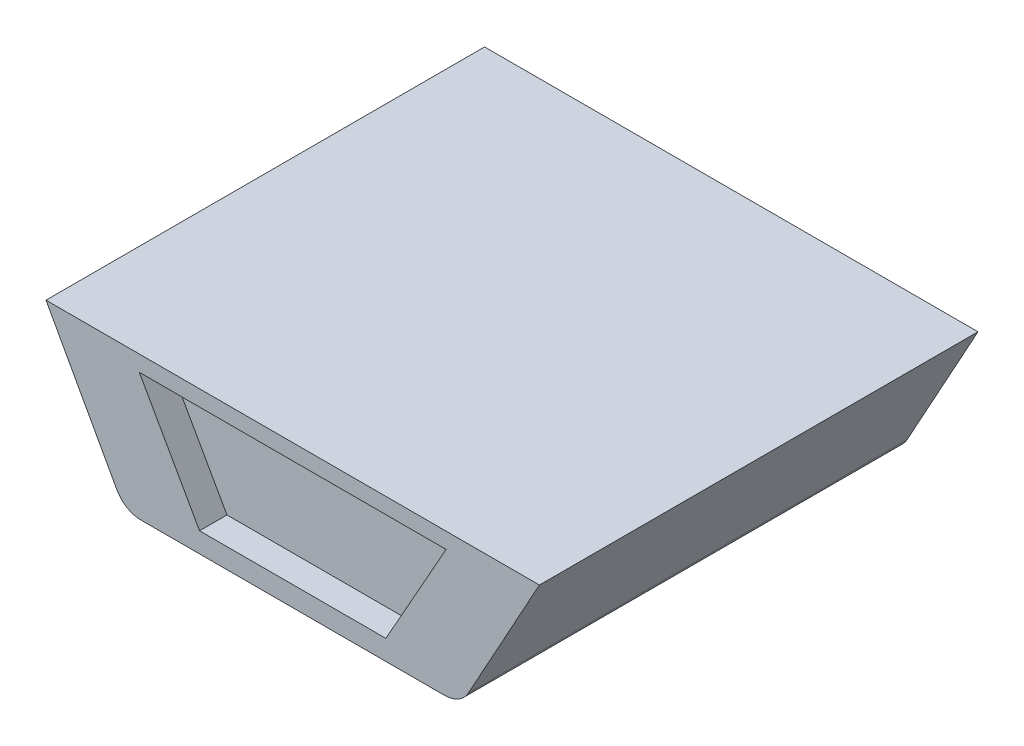
ISO-10303-21;
HEADER;
FILE_DESCRIPTION(('STEP AP214'),'2;1');
FILE_NAME('part.step','',(''),(''),'','','');
FILE_SCHEMA(('AUTOMOTIVE_DESIGN { 1 0 10303 214 1 1 1 1 }'));
ENDSEC;
DATA;
#1=APPLICATION_CONTEXT('core data for automotive mechanical design processes');
#2=APPLICATION_PROTOCOL_DEFINITION('international standard','automotive_design',2000,#1);
#3=PRODUCT_CONTEXT('',#1,'mechanical');
#4=PRODUCT('Part','Part','',(#3));
#5=PRODUCT_RELATED_PRODUCT_CATEGORY('part','',(#4));
#6=PRODUCT_DEFINITION_FORMATION('','',#4);
#7=PRODUCT_DEFINITION_CONTEXT('part definition',#1,'design');
#8=PRODUCT_DEFINITION('design','',#6,#7);
#9=PRODUCT_DEFINITION_SHAPE('','',#8);
#10=(LENGTH_UNIT() NAMED_UNIT(*) SI_UNIT(.MILLI.,.METRE.));
#11=(NAMED_UNIT(*) PLANE_ANGLE_UNIT() SI_UNIT($,.RADIAN.));
#12=(NAMED_UNIT(*) SI_UNIT($,.STERADIAN.) SOLID_ANGLE_UNIT());
#13=UNCERTAINTY_MEASURE_WITH_UNIT(LENGTH_MEASURE(1.E-05),#10,'distance_accuracy_value','');
#14=(GEOMETRIC_REPRESENTATION_CONTEXT(3) GLOBAL_UNCERTAINTY_ASSIGNED_CONTEXT((#13)) GLOBAL_UNIT_ASSIGNED_CONTEXT((#10,
#11,#12)) REPRESENTATION_CONTEXT('',''));
#15=CARTESIAN_POINT('',(0.,0.,0.));
#16=DIRECTION('',(0.,0.,1.));
#17=DIRECTION('',(1.,0.,0.));
#18=AXIS2_PLACEMENT_3D('',#15,#16,#17);
#19=CARTESIAN_POINT('',(-70.0985456524814,-38.5749393235548,203.2));
#20=DIRECTION('',(0.87610643371878,0.482117741632228,0.));
#21=DIRECTION('',(-0.482117741632228,0.876106433718781,0.));
#22=AXIS2_PLACEMENT_3D('',#19,#20,#21);
#23=PLANE('',#22);
#24=DIRECTION('',(0.482117741632228,-0.876106433718781,0.));
#25=VECTOR('',#24,1.);
#26=CARTESIAN_POINT('',(-70.0985456524814,-38.5749393235548,0.));
#27=LINE('',#26,#25);
#28=CARTESIAN_POINT('',(-114.3,41.7481336305382,0.));
#29=VERTEX_POINT('',#28);
#30=CARTESIAN_POINT('',(-81.463236772202,-17.9229737404066,0.));
#31=VERTEX_POINT('',#30);
#32=EDGE_CURVE('E208',#29,#31,#27,.T.);
#33=ORIENTED_EDGE('',*,*,#32,.T.);
#34=DIRECTION('',(0.,0.,-1.));
#35=VECTOR('',#34,1.);
#36=CARTESIAN_POINT('',(-81.463236772202,-17.9229737404066,203.2));
#37=LINE('',#36,#35);
#38=CARTESIAN_POINT('',(-81.463236772202,-17.9229737404066,203.2));
#39=VERTEX_POINT('',#38);
#40=EDGE_CURVE('E58',#31,#39,#37,.F.);
#41=ORIENTED_EDGE('',*,*,#40,.T.);
#42=DIRECTION('',(0.482117741632228,-0.876106433718781,0.));
#43=VECTOR('',#42,1.);
#44=CARTESIAN_POINT('',(-70.0985456524814,-38.5749393235548,203.2));
#45=LINE('',#44,#43);
#46=CARTESIAN_POINT('',(-114.3,41.7481336305382,203.2));
#47=VERTEX_POINT('',#46);
#48=EDGE_CURVE('E215',#47,#39,#45,.T.);
#49=ORIENTED_EDGE('',*,*,#48,.F.);
#50=DIRECTION('',(0.,0.,-1.));
#51=VECTOR('',#50,1.);
#52=CARTESIAN_POINT('',(-114.3,41.7481336305382,203.2));
#53=LINE('',#52,#51);
#54=EDGE_CURVE('E226',#47,#29,#53,.T.);
#55=ORIENTED_EDGE('',*,*,#54,.T.);
#56=EDGE_LOOP('',(#33,#41,#49,#55));
#57=FACE_BOUND('',#56,.T.);
#58=ADVANCED_FACE('F35',(#57),#23,.F.);
#59=CARTESIAN_POINT('',(0.,-24.5000784216773,203.2));
#60=DIRECTION('',(0.,-1.,0.));
#61=DIRECTION('',(1.,0.,0.));
#62=AXIS2_PLACEMENT_3D('',#59,#60,#61);
#63=PLANE('',#62);
#64=DIRECTION('',(-1.,0.,0.));
#65=VECTOR('',#64,1.);
#66=CARTESIAN_POINT('',(0.,-24.5000784216773,203.2));
#67=LINE('',#66,#65);
#68=CARTESIAN_POINT('',(70.3366850639734,-24.5000784216773,203.2));
#69=VERTEX_POINT('',#68);
#70=CARTESIAN_POINT('',(-70.3366850639735,-24.5000784216773,203.2));
#71=VERTEX_POINT('',#70);
#72=EDGE_CURVE('E217',#69,#71,#67,.T.);
#73=ORIENTED_EDGE('',*,*,#72,.T.);
#74=DIRECTION('',(0.,0.,-1.));
#75=VECTOR('',#74,1.);
#76=CARTESIAN_POINT('',(-70.3366850639735,-24.5000784216773,0.));
#77=LINE('',#76,#75);
#78=CARTESIAN_POINT('',(-70.3366850639735,-24.5000784216773,0.));
#79=VERTEX_POINT('',#78);
#80=EDGE_CURVE('E241',#71,#79,#77,.T.);
#81=ORIENTED_EDGE('',*,*,#80,.T.);
#82=DIRECTION('',(-1.,0.,0.));
#83=VECTOR('',#82,1.);
#84=CARTESIAN_POINT('',(0.,-24.5000784216773,0.));
#85=LINE('',#84,#83);
#86=CARTESIAN_POINT('',(70.3366850639734,-24.5000784216773,0.));
#87=VERTEX_POINT('',#86);
#88=EDGE_CURVE('E228',#87,#79,#85,.T.);
#89=ORIENTED_EDGE('',*,*,#88,.F.);
#90=DIRECTION('',(0.,0.,-1.));
#91=VECTOR('',#90,1.);
#92=CARTESIAN_POINT('',(70.3366850639734,-24.5000784216773,203.2));
#93=LINE('',#92,#91);
#94=EDGE_CURVE('E239',#87,#69,#93,.F.);
#95=ORIENTED_EDGE('',*,*,#94,.T.);
#96=EDGE_LOOP('',(#73,#81,#89,#95));
#97=FACE_BOUND('',#96,.T.);
#98=ADVANCED_FACE('F255',(#97),#63,.T.);
#99=CARTESIAN_POINT('',(70.0985456524814,-38.5749393235548,203.2));
#100=DIRECTION('',(0.87610643371878,-0.482117741632228,0.));
#101=DIRECTION('',(0.482117741632228,0.876106433718781,0.));
#102=AXIS2_PLACEMENT_3D('',#99,#100,#101);
#103=PLANE('',#102);
#104=DIRECTION('',(-0.482117741632228,-0.876106433718781,0.));
#105=VECTOR('',#104,1.);
#106=CARTESIAN_POINT('',(70.0985456524814,-38.5749393235548,203.2));
#107=LINE('',#106,#105);
#108=CARTESIAN_POINT('',(114.3,41.7481336305382,203.2));
#109=VERTEX_POINT('',#108);
#110=CARTESIAN_POINT('',(81.463236772202,-17.9229737404066,203.2));
#111=VERTEX_POINT('',#110);
#112=EDGE_CURVE('E221',#109,#111,#107,.T.);
#113=ORIENTED_EDGE('',*,*,#112,.T.);
#114=DIRECTION('',(0.,0.,-1.));
#115=VECTOR('',#114,1.);
#116=CARTESIAN_POINT('',(81.463236772202,-17.9229737404066,203.2));
#117=LINE('',#116,#115);
#118=CARTESIAN_POINT('',(81.463236772202,-17.9229737404066,0.));
#119=VERTEX_POINT('',#118);
#120=EDGE_CURVE('E11',#111,#119,#117,.T.);
#121=ORIENTED_EDGE('',*,*,#120,.T.);
#122=DIRECTION('',(-0.482117741632228,-0.876106433718781,0.));
#123=VECTOR('',#122,1.);
#124=CARTESIAN_POINT('',(70.0985456524814,-38.5749393235548,0.));
#125=LINE('',#124,#123);
#126=CARTESIAN_POINT('',(114.3,41.7481336305382,0.));
#127=VERTEX_POINT('',#126);
#128=EDGE_CURVE('E231',#127,#119,#125,.T.);
#129=ORIENTED_EDGE('',*,*,#128,.F.);
#130=DIRECTION('',(0.,0.,-1.));
#131=VECTOR('',#130,1.);
#132=CARTESIAN_POINT('',(114.3,41.7481336305382,203.2));
#133=LINE('',#132,#131);
#134=EDGE_CURVE('E237',#109,#127,#133,.T.);
#135=ORIENTED_EDGE('',*,*,#134,.F.);
#136=EDGE_LOOP('',(#113,#121,#129,#135));
#137=FACE_BOUND('',#136,.T.);
#138=ADVANCED_FACE('F267',(#137),#103,.T.);
#139=CARTESIAN_POINT('',(0.,41.7481336305382,203.2));
#140=DIRECTION('',(0.,1.,0.));
#141=DIRECTION('',(-1.,0.,0.));
#142=AXIS2_PLACEMENT_3D('',#139,#140,#141);
#143=PLANE('',#142);
#144=DIRECTION('',(1.,0.,0.));
#145=VECTOR('',#144,1.);
#146=CARTESIAN_POINT('',(0.,41.7481336305382,0.));
#147=LINE('',#146,#145);
#148=EDGE_CURVE('E218',#29,#127,#147,.T.);
#149=ORIENTED_EDGE('',*,*,#148,.F.);
#150=ORIENTED_EDGE('',*,*,#54,.F.);
#151=DIRECTION('',(1.,0.,0.));
#152=VECTOR('',#151,1.);
#153=CARTESIAN_POINT('',(0.,41.7481336305382,203.2));
#154=LINE('',#153,#152);
#155=EDGE_CURVE('E223',#47,#109,#154,.T.);
#156=ORIENTED_EDGE('',*,*,#155,.T.);
#157=ORIENTED_EDGE('',*,*,#134,.T.);
#158=EDGE_LOOP('',(#149,#150,#156,#157));
#159=FACE_BOUND('',#158,.T.);
#160=ADVANCED_FACE('F264',(#159),#143,.T.);
#161=CARTESIAN_POINT('',(0.,0.,203.2));
#162=DIRECTION('',(0.,0.,1.));
#163=DIRECTION('',(1.,0.,0.));
#164=AXIS2_PLACEMENT_3D('',#161,#162,#163);
#165=PLANE('',#164);
#166=DIRECTION('',(0.490144981755459,-0.871640921974147,0.));
#167=VECTOR('',#166,1.);
#168=CARTESIAN_POINT('',(-71.0759168581774,34.4133253858701,203.2));
#169=LINE('',#168,#167);
#170=CARTESIAN_POINT('',(-71.0759168581774,34.4133253858701,203.2));
#171=VERTEX_POINT('',#170);
#172=CARTESIAN_POINT('',(-43.1627081710388,-15.2256505517698,203.2));
#173=VERTEX_POINT('',#172);
#174=EDGE_CURVE('E147',#171,#173,#169,.T.);
#175=ORIENTED_EDGE('',*,*,#174,.F.);
#176=DIRECTION('',(-1.,0.,0.));
#177=VECTOR('',#176,1.);
#178=CARTESIAN_POINT('',(71.0759168581774,34.4133253858701,203.2));
#179=LINE('',#178,#177);
#180=CARTESIAN_POINT('',(71.0759168581774,34.4133253858701,203.2));
#181=VERTEX_POINT('',#180);
#182=EDGE_CURVE('E164',#181,#171,#179,.T.);
#183=ORIENTED_EDGE('',*,*,#182,.F.);
#184=DIRECTION('',(0.490144981755459,0.871640921974147,0.));
#185=VECTOR('',#184,1.);
#186=CARTESIAN_POINT('',(71.0759168581774,34.4133253858701,203.2));
#187=LINE('',#186,#185);
#188=CARTESIAN_POINT('',(43.1627081710388,-15.2256505517698,203.2));
#189=VERTEX_POINT('',#188);
#190=EDGE_CURVE('E167',#189,#181,#187,.T.);
#191=ORIENTED_EDGE('',*,*,#190,.F.);
#192=DIRECTION('',(1.,0.,0.));
#193=VECTOR('',#192,1.);
#194=CARTESIAN_POINT('',(-43.1627081710388,-15.2256505517698,203.2));
#195=LINE('',#194,#193);
#196=EDGE_CURVE('E173',#173,#189,#195,.T.);
#197=ORIENTED_EDGE('',*,*,#196,.F.);
#198=EDGE_LOOP('',(#175,#183,#191,#197));
#199=FACE_BOUND('',#198,.T.);
#200=ORIENTED_EDGE('',*,*,#48,.T.);
#201=CARTESIAN_POINT('',(-70.3366850639735,-11.8000784216773,203.2));
#202=DIRECTION('',(0.,0.,1.));
#203=DIRECTION('',(1.,0.,0.));
#204=AXIS2_PLACEMENT_3D('',#201,#202,#203);
#205=CIRCLE('',#204,12.7);
#206=EDGE_CURVE('E43',#39,#71,#205,.T.);
#207=ORIENTED_EDGE('',*,*,#206,.T.);
#208=ORIENTED_EDGE('',*,*,#72,.F.);
#209=CARTESIAN_POINT('',(70.3366850639734,-11.8000784216773,203.2));
#210=DIRECTION('',(0.,0.,1.));
#211=DIRECTION('',(1.,0.,0.));
#212=AXIS2_PLACEMENT_3D('',#209,#210,#211);
#213=CIRCLE('',#212,12.7);
#214=EDGE_CURVE('E50',#69,#111,#213,.T.);
#215=ORIENTED_EDGE('',*,*,#214,.T.);
#216=ORIENTED_EDGE('',*,*,#112,.F.);
#217=ORIENTED_EDGE('',*,*,#155,.F.);
#218=EDGE_LOOP('',(#200,#207,#208,#215,#216,#217));
#219=FACE_BOUND('',#218,.T.);
#220=ADVANCED_FACE('F250',(#199,#219),#165,.T.);
#221=CARTESIAN_POINT('',(0.,0.,0.));
#222=DIRECTION('',(0.,0.,1.));
#223=DIRECTION('',(1.,0.,0.));
#224=AXIS2_PLACEMENT_3D('',#221,#222,#223);
#225=PLANE('',#224);
#226=DIRECTION('',(-1.,0.,0.));
#227=VECTOR('',#226,1.);
#228=CARTESIAN_POINT('',(40.3989196293821,-12.2945288675993,0.));
#229=LINE('',#228,#227);
#230=CARTESIAN_POINT('',(40.3989196293821,-12.2945288675993,0.));
#231=VERTEX_POINT('',#230);
#232=CARTESIAN_POINT('',(-40.3989196293821,-12.2945288675993,0.));
#233=VERTEX_POINT('',#232);
#234=EDGE_CURVE('E198',#231,#233,#229,.T.);
#235=ORIENTED_EDGE('',*,*,#234,.F.);
#236=DIRECTION('',(-0.41926540400879,-0.907863712790277,0.));
#237=VECTOR('',#236,1.);
#238=CARTESIAN_POINT('',(61.6109656640447,33.6373478977521,0.));
#239=LINE('',#238,#237);
#240=CARTESIAN_POINT('',(61.6109656640447,33.6373478977521,0.));
#241=VERTEX_POINT('',#240);
#242=EDGE_CURVE('E179',#241,#231,#239,.T.);
#243=ORIENTED_EDGE('',*,*,#242,.F.);
#244=DIRECTION('',(1.,0.,0.));
#245=VECTOR('',#244,1.);
#246=CARTESIAN_POINT('',(-61.6109656640447,33.6373478977521,0.));
#247=LINE('',#246,#245);
#248=CARTESIAN_POINT('',(-61.6109656640447,33.6373478977521,0.));
#249=VERTEX_POINT('',#248);
#250=EDGE_CURVE('E187',#249,#241,#247,.T.);
#251=ORIENTED_EDGE('',*,*,#250,.F.);
#252=DIRECTION('',(-0.41926540400879,0.907863712790277,0.));
#253=VECTOR('',#252,1.);
#254=CARTESIAN_POINT('',(-61.6109656640447,33.6373478977521,0.));
#255=LINE('',#254,#253);
#256=EDGE_CURVE('E201',#233,#249,#255,.T.);
#257=ORIENTED_EDGE('',*,*,#256,.F.);
#258=EDGE_LOOP('',(#235,#243,#251,#257));
#259=FACE_BOUND('',#258,.T.);
#260=ORIENTED_EDGE('',*,*,#88,.T.);
#261=CARTESIAN_POINT('',(-70.3366850639735,-11.8000784216773,0.));
#262=DIRECTION('',(0.,0.,1.));
#263=DIRECTION('',(1.,0.,0.));
#264=AXIS2_PLACEMENT_3D('',#261,#262,#263);
#265=CIRCLE('',#264,12.7);
#266=EDGE_CURVE('E246',#79,#31,#265,.F.);
#267=ORIENTED_EDGE('',*,*,#266,.T.);
#268=ORIENTED_EDGE('',*,*,#32,.F.);
#269=ORIENTED_EDGE('',*,*,#148,.T.);
#270=ORIENTED_EDGE('',*,*,#128,.T.);
#271=CARTESIAN_POINT('',(70.3366850639734,-11.8000784216773,0.));
#272=DIRECTION('',(0.,0.,1.));
#273=DIRECTION('',(1.,0.,0.));
#274=AXIS2_PLACEMENT_3D('',#271,#272,#273);
#275=CIRCLE('',#274,12.7);
#276=EDGE_CURVE('E244',#119,#87,#275,.F.);
#277=ORIENTED_EDGE('',*,*,#276,.T.);
#278=EDGE_LOOP('',(#260,#267,#268,#269,#270,#277));
#279=FACE_BOUND('',#278,.T.);
#280=ADVANCED_FACE('F261',(#259,#279),#225,.F.);
#281=CARTESIAN_POINT('',(61.6109656640447,33.6373478977521,12.7));
#282=DIRECTION('',(0.907863712790277,-0.41926540400879,0.));
#283=DIRECTION('',(0.41926540400879,0.907863712790277,0.));
#284=AXIS2_PLACEMENT_3D('',#281,#282,#283);
#285=PLANE('',#284);
#286=ORIENTED_EDGE('',*,*,#242,.T.);
#287=DIRECTION('',(0.,0.,-1.));
#288=VECTOR('',#287,1.);
#289=CARTESIAN_POINT('',(40.3989196293821,-12.2945288675993,12.7));
#290=LINE('',#289,#288);
#291=CARTESIAN_POINT('',(40.3989196293821,-12.2945288675993,12.7));
#292=VERTEX_POINT('',#291);
#293=EDGE_CURVE('E196',#292,#231,#290,.T.);
#294=ORIENTED_EDGE('',*,*,#293,.F.);
#295=DIRECTION('',(-0.41926540400879,-0.907863712790277,0.));
#296=VECTOR('',#295,1.);
#297=CARTESIAN_POINT('',(61.6109656640447,33.6373478977521,12.7));
#298=LINE('',#297,#296);
#299=CARTESIAN_POINT('',(61.6109656640447,33.6373478977521,12.7));
#300=VERTEX_POINT('',#299);
#301=EDGE_CURVE('E183',#300,#292,#298,.T.);
#302=ORIENTED_EDGE('',*,*,#301,.F.);
#303=DIRECTION('',(0.,0.,-1.));
#304=VECTOR('',#303,1.);
#305=CARTESIAN_POINT('',(61.6109656640447,33.6373478977521,12.7));
#306=LINE('',#305,#304);
#307=EDGE_CURVE('E206',#300,#241,#306,.T.);
#308=ORIENTED_EDGE('',*,*,#307,.T.);
#309=EDGE_LOOP('',(#286,#294,#302,#308));
#310=FACE_BOUND('',#309,.T.);
#311=ADVANCED_FACE('F287',(#310),#285,.F.);
#312=CARTESIAN_POINT('',(-61.6109656640447,33.6373478977521,12.7));
#313=DIRECTION('',(0.,1.,0.));
#314=DIRECTION('',(0.,0.,1.));
#315=AXIS2_PLACEMENT_3D('',#312,#313,#314);
#316=PLANE('',#315);
#317=ORIENTED_EDGE('',*,*,#250,.T.);
#318=ORIENTED_EDGE('',*,*,#307,.F.);
#319=DIRECTION('',(1.,0.,0.));
#320=VECTOR('',#319,1.);
#321=CARTESIAN_POINT('',(-61.6109656640447,33.6373478977521,12.7));
#322=LINE('',#321,#320);
#323=CARTESIAN_POINT('',(-61.6109656640447,33.6373478977521,12.7));
#324=VERTEX_POINT('',#323);
#325=EDGE_CURVE('E193',#324,#300,#322,.T.);
#326=ORIENTED_EDGE('',*,*,#325,.F.);
#327=DIRECTION('',(0.,0.,-1.));
#328=VECTOR('',#327,1.);
#329=CARTESIAN_POINT('',(-61.6109656640447,33.6373478977521,12.7));
#330=LINE('',#329,#328);
#331=EDGE_CURVE('E209',#324,#249,#330,.T.);
#332=ORIENTED_EDGE('',*,*,#331,.T.);
#333=EDGE_LOOP('',(#317,#318,#326,#332));
#334=FACE_BOUND('',#333,.T.);
#335=ADVANCED_FACE('F294',(#334),#316,.F.);
#336=CARTESIAN_POINT('',(-61.6109656640447,33.6373478977521,12.7));
#337=DIRECTION('',(-0.907863712790277,-0.41926540400879,0.));
#338=DIRECTION('',(0.41926540400879,-0.907863712790277,0.));
#339=AXIS2_PLACEMENT_3D('',#336,#337,#338);
#340=PLANE('',#339);
#341=ORIENTED_EDGE('',*,*,#256,.T.);
#342=ORIENTED_EDGE('',*,*,#331,.F.);
#343=DIRECTION('',(-0.41926540400879,0.907863712790277,0.));
#344=VECTOR('',#343,1.);
#345=CARTESIAN_POINT('',(-61.6109656640447,33.6373478977521,12.7));
#346=LINE('',#345,#344);
#347=CARTESIAN_POINT('',(-40.3989196293821,-12.2945288675993,12.7));
#348=VERTEX_POINT('',#347);
#349=EDGE_CURVE('E190',#348,#324,#346,.T.);
#350=ORIENTED_EDGE('',*,*,#349,.F.);
#351=DIRECTION('',(0.,0.,-1.));
#352=VECTOR('',#351,1.);
#353=CARTESIAN_POINT('',(-40.3989196293821,-12.2945288675993,12.7));
#354=LINE('',#353,#352);
#355=EDGE_CURVE('E211',#348,#233,#354,.T.);
#356=ORIENTED_EDGE('',*,*,#355,.T.);
#357=EDGE_LOOP('',(#341,#342,#350,#356));
#358=FACE_BOUND('',#357,.T.);
#359=ADVANCED_FACE('F300',(#358),#340,.F.);
#360=CARTESIAN_POINT('',(40.3989196293821,-12.2945288675993,12.7));
#361=DIRECTION('',(0.,-1.,0.));
#362=DIRECTION('',(0.,0.,-1.));
#363=AXIS2_PLACEMENT_3D('',#360,#361,#362);
#364=PLANE('',#363);
#365=ORIENTED_EDGE('',*,*,#234,.T.);
#366=ORIENTED_EDGE('',*,*,#355,.F.);
#367=DIRECTION('',(-1.,0.,0.));
#368=VECTOR('',#367,1.);
#369=CARTESIAN_POINT('',(40.3989196293821,-12.2945288675993,12.7));
#370=LINE('',#369,#368);
#371=EDGE_CURVE('E186',#292,#348,#370,.T.);
#372=ORIENTED_EDGE('',*,*,#371,.F.);
#373=ORIENTED_EDGE('',*,*,#293,.T.);
#374=EDGE_LOOP('',(#365,#366,#372,#373));
#375=FACE_BOUND('',#374,.T.);
#376=ADVANCED_FACE('F296',(#375),#364,.F.);
#377=CARTESIAN_POINT('',(0.,0.,12.7));
#378=DIRECTION('',(0.,0.,-1.));
#379=DIRECTION('',(-1.,0.,0.));
#380=AXIS2_PLACEMENT_3D('',#377,#378,#379);
#381=PLANE('',#380);
#382=ORIENTED_EDGE('',*,*,#301,.T.);
#383=ORIENTED_EDGE('',*,*,#371,.T.);
#384=ORIENTED_EDGE('',*,*,#349,.T.);
#385=ORIENTED_EDGE('',*,*,#325,.T.);
#386=EDGE_LOOP('',(#382,#383,#384,#385));
#387=FACE_BOUND('',#386,.T.);
#388=ADVANCED_FACE('F299',(#387),#381,.T.);
#389=CARTESIAN_POINT('',(-71.0759168581774,34.4133253858701,190.5));
#390=DIRECTION('',(-0.871640921974147,-0.490144981755459,0.));
#391=DIRECTION('',(0.49014498175546,-0.871640921974147,0.));
#392=AXIS2_PLACEMENT_3D('',#389,#390,#391);
#393=PLANE('',#392);
#394=ORIENTED_EDGE('',*,*,#174,.T.);
#395=DIRECTION('',(0.,0.,1.));
#396=VECTOR('',#395,1.);
#397=CARTESIAN_POINT('',(-43.1627081710388,-15.2256505517698,190.5));
#398=LINE('',#397,#396);
#399=CARTESIAN_POINT('',(-43.1627081710388,-15.2256505517698,190.5));
#400=VERTEX_POINT('',#399);
#401=EDGE_CURVE('E140',#400,#173,#398,.T.);
#402=ORIENTED_EDGE('',*,*,#401,.F.);
#403=DIRECTION('',(0.490144981755459,-0.871640921974147,0.));
#404=VECTOR('',#403,1.);
#405=CARTESIAN_POINT('',(-71.0759168581774,34.4133253858701,190.5));
#406=LINE('',#405,#404);
#407=CARTESIAN_POINT('',(-71.0759168581774,34.4133253858701,190.5));
#408=VERTEX_POINT('',#407);
#409=EDGE_CURVE('E144',#408,#400,#406,.T.);
#410=ORIENTED_EDGE('',*,*,#409,.F.);
#411=DIRECTION('',(0.,0.,1.));
#412=VECTOR('',#411,1.);
#413=CARTESIAN_POINT('',(-71.0759168581774,34.4133253858701,190.5));
#414=LINE('',#413,#412);
#415=EDGE_CURVE('E177',#408,#171,#414,.T.);
#416=ORIENTED_EDGE('',*,*,#415,.T.);
#417=EDGE_LOOP('',(#394,#402,#410,#416));
#418=FACE_BOUND('',#417,.T.);
#419=ADVANCED_FACE('F142',(#418),#393,.F.);
#420=CARTESIAN_POINT('',(71.0759168581774,34.4133253858701,190.5));
#421=DIRECTION('',(0.,1.,0.));
#422=DIRECTION('',(0.,0.,1.));
#423=AXIS2_PLACEMENT_3D('',#420,#421,#422);
#424=PLANE('',#423);
#425=ORIENTED_EDGE('',*,*,#182,.T.);
#426=ORIENTED_EDGE('',*,*,#415,.F.);
#427=DIRECTION('',(-1.,0.,0.));
#428=VECTOR('',#427,1.);
#429=CARTESIAN_POINT('',(71.0759168581774,34.4133253858701,190.5));
#430=LINE('',#429,#428);
#431=CARTESIAN_POINT('',(71.0759168581774,34.4133253858701,190.5));
#432=VERTEX_POINT('',#431);
#433=EDGE_CURVE('E152',#432,#408,#430,.T.);
#434=ORIENTED_EDGE('',*,*,#433,.F.);
#435=DIRECTION('',(0.,0.,1.));
#436=VECTOR('',#435,1.);
#437=CARTESIAN_POINT('',(71.0759168581774,34.4133253858701,190.5));
#438=LINE('',#437,#436);
#439=EDGE_CURVE('E180',#432,#181,#438,.T.);
#440=ORIENTED_EDGE('',*,*,#439,.T.);
#441=EDGE_LOOP('',(#425,#426,#434,#440));
#442=FACE_BOUND('',#441,.T.);
#443=ADVANCED_FACE('F313',(#442),#424,.F.);
#444=CARTESIAN_POINT('',(71.0759168581774,34.4133253858701,190.5));
#445=DIRECTION('',(0.871640921974147,-0.490144981755459,0.));
#446=DIRECTION('',(0.49014498175546,0.871640921974147,0.));
#447=AXIS2_PLACEMENT_3D('',#444,#445,#446);
#448=PLANE('',#447);
#449=ORIENTED_EDGE('',*,*,#190,.T.);
#450=ORIENTED_EDGE('',*,*,#439,.F.);
#451=DIRECTION('',(0.490144981755459,0.871640921974147,0.));
#452=VECTOR('',#451,1.);
#453=CARTESIAN_POINT('',(71.0759168581774,34.4133253858701,190.5));
#454=LINE('',#453,#452);
#455=CARTESIAN_POINT('',(43.1627081710388,-15.2256505517698,190.5));
#456=VERTEX_POINT('',#455);
#457=EDGE_CURVE('E160',#456,#432,#454,.T.);
#458=ORIENTED_EDGE('',*,*,#457,.F.);
#459=DIRECTION('',(0.,0.,1.));
#460=VECTOR('',#459,1.);
#461=CARTESIAN_POINT('',(43.1627081710388,-15.2256505517698,190.5));
#462=LINE('',#461,#460);
#463=EDGE_CURVE('E151',#456,#189,#462,.T.);
#464=ORIENTED_EDGE('',*,*,#463,.T.);
#465=EDGE_LOOP('',(#449,#450,#458,#464));
#466=FACE_BOUND('',#465,.T.);
#467=ADVANCED_FACE('F316',(#466),#448,.F.);
#468=CARTESIAN_POINT('',(-43.1627081710388,-15.2256505517698,190.5));
#469=DIRECTION('',(0.,-1.,0.));
#470=DIRECTION('',(0.,0.,-1.));
#471=AXIS2_PLACEMENT_3D('',#468,#469,#470);
#472=PLANE('',#471);
#473=ORIENTED_EDGE('',*,*,#196,.T.);
#474=ORIENTED_EDGE('',*,*,#463,.F.);
#475=DIRECTION('',(1.,0.,0.));
#476=VECTOR('',#475,1.);
#477=CARTESIAN_POINT('',(-43.1627081710388,-15.2256505517698,190.5));
#478=LINE('',#477,#476);
#479=EDGE_CURVE('E155',#400,#456,#478,.T.);
#480=ORIENTED_EDGE('',*,*,#479,.F.);
#481=ORIENTED_EDGE('',*,*,#401,.T.);
#482=EDGE_LOOP('',(#473,#474,#480,#481));
#483=FACE_BOUND('',#482,.T.);
#484=ADVANCED_FACE('F156',(#483),#472,.F.);
#485=CARTESIAN_POINT('',(0.,0.,190.5));
#486=DIRECTION('',(0.,0.,1.));
#487=DIRECTION('',(1.,0.,0.));
#488=AXIS2_PLACEMENT_3D('',#485,#486,#487);
#489=PLANE('',#488);
#490=ORIENTED_EDGE('',*,*,#409,.T.);
#491=ORIENTED_EDGE('',*,*,#479,.T.);
#492=ORIENTED_EDGE('',*,*,#457,.T.);
#493=ORIENTED_EDGE('',*,*,#433,.T.);
#494=EDGE_LOOP('',(#490,#491,#492,#493));
#495=FACE_BOUND('',#494,.T.);
#496=ADVANCED_FACE('F162',(#495),#489,.T.);
#497=CARTESIAN_POINT('',(-70.3366850639735,-11.8000784216773,203.2));
#498=DIRECTION('',(0.,0.,1.));
#499=DIRECTION('',(1.,0.,0.));
#500=AXIS2_PLACEMENT_3D('',#497,#498,#499);
#501=CYLINDRICAL_SURFACE('',#500,12.7);
#502=ORIENTED_EDGE('',*,*,#206,.F.);
#503=ORIENTED_EDGE('',*,*,#40,.F.);
#504=ORIENTED_EDGE('',*,*,#266,.F.);
#505=ORIENTED_EDGE('',*,*,#80,.F.);
#506=EDGE_LOOP('',(#502,#503,#504,#505));
#507=FACE_BOUND('',#506,.T.);
#508=ADVANCED_FACE('F258',(#507),#501,.T.);
#509=CARTESIAN_POINT('',(70.3366850639734,-11.8000784216773,203.2));
#510=DIRECTION('',(0.,0.,-1.));
#511=DIRECTION('',(-1.,0.,0.));
#512=AXIS2_PLACEMENT_3D('',#509,#510,#511);
#513=CYLINDRICAL_SURFACE('',#512,12.7);
#514=ORIENTED_EDGE('',*,*,#214,.F.);
#515=ORIENTED_EDGE('',*,*,#94,.F.);
#516=ORIENTED_EDGE('',*,*,#276,.F.);
#517=ORIENTED_EDGE('',*,*,#120,.F.);
#518=EDGE_LOOP('',(#514,#515,#516,#517));
#519=FACE_BOUND('',#518,.T.);
#520=ADVANCED_FACE('F37',(#519),#513,.T.);
#521=CLOSED_SHELL('',(#58,#98,#138,#160,#220,#280,#311,#335,#359,#376,#388,#419,#443,#467,#484,
#496,#508,#520));
#522=MANIFOLD_SOLID_BREP('B2',#521);
#523=ADVANCED_BREP_SHAPE_REPRESENTATION('',(#18,#522),#14);
#524=SHAPE_DEFINITION_REPRESENTATION(#9,#523);
ENDSEC;
END-ISO-10303-21;
